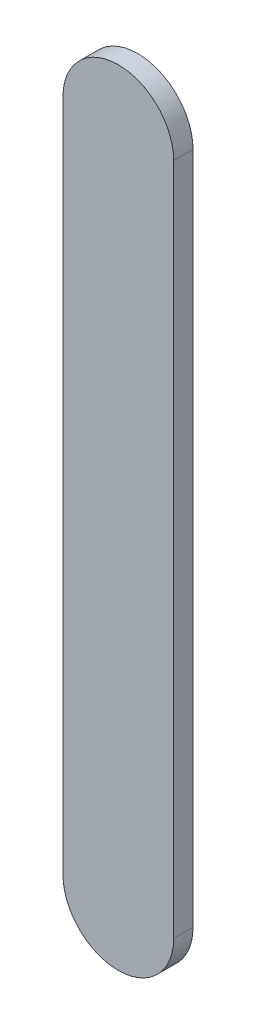
ISO-10303-21;
HEADER;
FILE_DESCRIPTION(('STEP AP214'),'2;1');
FILE_NAME('part.step','',(''),(''),'','','');
FILE_SCHEMA(('AUTOMOTIVE_DESIGN { 1 0 10303 214 1 1 1 1 }'));
ENDSEC;
DATA;
#1=APPLICATION_CONTEXT('core data for automotive mechanical design processes');
#2=APPLICATION_PROTOCOL_DEFINITION('international standard','automotive_design',2000,#1);
#3=PRODUCT_CONTEXT('',#1,'mechanical');
#4=PRODUCT('Part','Part','',(#3));
#5=PRODUCT_RELATED_PRODUCT_CATEGORY('part','',(#4));
#6=PRODUCT_DEFINITION_FORMATION('','',#4);
#7=PRODUCT_DEFINITION_CONTEXT('part definition',#1,'design');
#8=PRODUCT_DEFINITION('design','',#6,#7);
#9=PRODUCT_DEFINITION_SHAPE('','',#8);
#10=(LENGTH_UNIT() NAMED_UNIT(*) SI_UNIT(.MILLI.,.METRE.));
#11=(NAMED_UNIT(*) PLANE_ANGLE_UNIT() SI_UNIT($,.RADIAN.));
#12=(NAMED_UNIT(*) SI_UNIT($,.STERADIAN.) SOLID_ANGLE_UNIT());
#13=UNCERTAINTY_MEASURE_WITH_UNIT(LENGTH_MEASURE(1.E-05),#10,'distance_accuracy_value','');
#14=(GEOMETRIC_REPRESENTATION_CONTEXT(3) GLOBAL_UNCERTAINTY_ASSIGNED_CONTEXT((#13)) GLOBAL_UNIT_ASSIGNED_CONTEXT((#10,
#11,#12)) REPRESENTATION_CONTEXT('',''));
#15=CARTESIAN_POINT('',(0.,0.,0.));
#16=DIRECTION('',(0.,0.,1.));
#17=DIRECTION('',(1.,0.,0.));
#18=AXIS2_PLACEMENT_3D('',#15,#16,#17);
#19=CARTESIAN_POINT('',(83.55,-109.4625,1.635));
#20=DIRECTION('',(0.,0.,1.));
#21=DIRECTION('',(1.,0.,0.));
#22=AXIS2_PLACEMENT_3D('',#19,#20,#21);
#23=PLANE('',#22);
#24=DIRECTION('',(0.,1.,0.));
#25=VECTOR('',#24,1.);
#26=CARTESIAN_POINT('',(83.55,-109.4625,1.635));
#27=LINE('',#26,#25);
#28=CARTESIAN_POINT('',(83.55,-109.4625,1.635));
#29=VERTEX_POINT('',#28);
#30=CARTESIAN_POINT('',(83.55,-108.245,1.635));
#31=VERTEX_POINT('',#30);
#32=EDGE_CURVE('E69',#29,#31,#27,.T.);
#33=ORIENTED_EDGE('',*,*,#32,.T.);
#34=CARTESIAN_POINT('',(83.45,-108.245,1.635));
#35=DIRECTION('',(0.,0.,1.));
#36=DIRECTION('',(1.,-1.42108547152E-13,0.));
#37=AXIS2_PLACEMENT_3D('',#34,#35,#36);
#38=CIRCLE('',#37,0.1);
#39=CARTESIAN_POINT('',(83.35,-108.245,1.635));
#40=VERTEX_POINT('',#39);
#41=EDGE_CURVE('E100',#31,#40,#38,.T.);
#42=ORIENTED_EDGE('',*,*,#41,.T.);
#43=DIRECTION('',(0.,-1.,0.));
#44=VECTOR('',#43,1.);
#45=CARTESIAN_POINT('',(83.35,-108.245,1.635));
#46=LINE('',#45,#44);
#47=CARTESIAN_POINT('',(83.35,-109.4625,1.635));
#48=VERTEX_POINT('',#47);
#49=EDGE_CURVE('E71',#40,#48,#46,.T.);
#50=ORIENTED_EDGE('',*,*,#49,.T.);
#51=CARTESIAN_POINT('',(83.45,-109.4625,1.635));
#52=DIRECTION('',(0.,0.,1.));
#53=DIRECTION('',(-1.,0.,0.));
#54=AXIS2_PLACEMENT_3D('',#51,#52,#53);
#55=CIRCLE('',#54,0.1);
#56=EDGE_CURVE('E11',#48,#29,#55,.T.);
#57=ORIENTED_EDGE('',*,*,#56,.T.);
#58=EDGE_LOOP('',(#33,#42,#50,#57));
#59=FACE_BOUND('',#58,.T.);
#60=ADVANCED_FACE('F17',(#59),#23,.T.);
#61=CARTESIAN_POINT('',(83.55,-109.4625,1.6));
#62=DIRECTION('',(0.,0.,1.));
#63=DIRECTION('',(1.,0.,0.));
#64=AXIS2_PLACEMENT_3D('',#61,#62,#63);
#65=PLANE('',#64);
#66=CARTESIAN_POINT('',(83.45,-109.4625,1.6));
#67=DIRECTION('',(0.,0.,1.));
#68=DIRECTION('',(-1.,0.,0.));
#69=AXIS2_PLACEMENT_3D('',#66,#67,#68);
#70=CIRCLE('',#69,0.1);
#71=CARTESIAN_POINT('',(83.35,-109.4625,1.6));
#72=VERTEX_POINT('',#71);
#73=CARTESIAN_POINT('',(83.55,-109.4625,1.6));
#74=VERTEX_POINT('',#73);
#75=EDGE_CURVE('E25',#72,#74,#70,.T.);
#76=ORIENTED_EDGE('',*,*,#75,.F.);
#77=DIRECTION('',(0.,-1.,0.));
#78=VECTOR('',#77,1.);
#79=CARTESIAN_POINT('',(83.35,-108.245,1.6));
#80=LINE('',#79,#78);
#81=CARTESIAN_POINT('',(83.35,-108.245,1.6));
#82=VERTEX_POINT('',#81);
#83=EDGE_CURVE('E95',#82,#72,#80,.T.);
#84=ORIENTED_EDGE('',*,*,#83,.F.);
#85=CARTESIAN_POINT('',(83.45,-108.245,1.6));
#86=DIRECTION('',(0.,0.,1.));
#87=DIRECTION('',(1.,-1.42108547152E-13,0.));
#88=AXIS2_PLACEMENT_3D('',#85,#86,#87);
#89=CIRCLE('',#88,0.1);
#90=CARTESIAN_POINT('',(83.55,-108.245,1.6));
#91=VERTEX_POINT('',#90);
#92=EDGE_CURVE('E79',#91,#82,#89,.T.);
#93=ORIENTED_EDGE('',*,*,#92,.F.);
#94=DIRECTION('',(0.,1.,0.));
#95=VECTOR('',#94,1.);
#96=CARTESIAN_POINT('',(83.55,-109.4625,1.6));
#97=LINE('',#96,#95);
#98=EDGE_CURVE('E90',#74,#91,#97,.T.);
#99=ORIENTED_EDGE('',*,*,#98,.F.);
#100=EDGE_LOOP('',(#76,#84,#93,#99));
#101=FACE_BOUND('',#100,.T.);
#102=ADVANCED_FACE('F151',(#101),#65,.F.);
#103=CARTESIAN_POINT('',(83.45,-109.4625,1.6));
#104=DIRECTION('',(0.,0.,-1.));
#105=DIRECTION('',(-1.,0.,0.));
#106=AXIS2_PLACEMENT_3D('',#103,#104,#105);
#107=CYLINDRICAL_SURFACE('',#106,0.1);
#108=ORIENTED_EDGE('',*,*,#75,.T.);
#109=DIRECTION('',(0.,0.,1.));
#110=VECTOR('',#109,1.);
#111=CARTESIAN_POINT('',(83.55,-109.4625,1.6));
#112=LINE('',#111,#110);
#113=EDGE_CURVE('E74',#74,#29,#112,.T.);
#114=ORIENTED_EDGE('',*,*,#113,.T.);
#115=ORIENTED_EDGE('',*,*,#56,.F.);
#116=DIRECTION('',(0.,0.,1.));
#117=VECTOR('',#116,1.);
#118=CARTESIAN_POINT('',(83.35,-109.4625,1.6));
#119=LINE('',#118,#117);
#120=EDGE_CURVE('E99',#72,#48,#119,.T.);
#121=ORIENTED_EDGE('',*,*,#120,.F.);
#122=EDGE_LOOP('',(#108,#114,#115,#121));
#123=FACE_BOUND('',#122,.T.);
#124=ADVANCED_FACE('F75',(#123),#107,.T.);
#125=CARTESIAN_POINT('',(83.35,-108.245,1.6));
#126=DIRECTION('',(1.,0.,0.));
#127=DIRECTION('',(0.,1.,0.));
#128=AXIS2_PLACEMENT_3D('',#125,#126,#127);
#129=PLANE('',#128);
#130=ORIENTED_EDGE('',*,*,#83,.T.);
#131=ORIENTED_EDGE('',*,*,#120,.T.);
#132=ORIENTED_EDGE('',*,*,#49,.F.);
#133=DIRECTION('',(0.,0.,1.));
#134=VECTOR('',#133,1.);
#135=CARTESIAN_POINT('',(83.35,-108.245,1.6));
#136=LINE('',#135,#134);
#137=EDGE_CURVE('E93',#82,#40,#136,.T.);
#138=ORIENTED_EDGE('',*,*,#137,.F.);
#139=EDGE_LOOP('',(#130,#131,#132,#138));
#140=FACE_BOUND('',#139,.T.);
#141=ADVANCED_FACE('F156',(#140),#129,.F.);
#142=CARTESIAN_POINT('',(83.45,-108.245,1.6));
#143=DIRECTION('',(0.,0.,-1.));
#144=DIRECTION('',(1.,-1.42108547152E-13,0.));
#145=AXIS2_PLACEMENT_3D('',#142,#143,#144);
#146=CYLINDRICAL_SURFACE('',#145,0.1);
#147=ORIENTED_EDGE('',*,*,#92,.T.);
#148=ORIENTED_EDGE('',*,*,#137,.T.);
#149=ORIENTED_EDGE('',*,*,#41,.F.);
#150=DIRECTION('',(0.,0.,1.));
#151=VECTOR('',#150,1.);
#152=CARTESIAN_POINT('',(83.55,-108.245,1.6));
#153=LINE('',#152,#151);
#154=EDGE_CURVE('E83',#91,#31,#153,.T.);
#155=ORIENTED_EDGE('',*,*,#154,.F.);
#156=EDGE_LOOP('',(#147,#148,#149,#155));
#157=FACE_BOUND('',#156,.T.);
#158=ADVANCED_FACE('F154',(#157),#146,.T.);
#159=CARTESIAN_POINT('',(83.55,-109.4625,1.6));
#160=DIRECTION('',(-1.,0.,0.));
#161=DIRECTION('',(0.,0.,1.));
#162=AXIS2_PLACEMENT_3D('',#159,#160,#161);
#163=PLANE('',#162);
#164=ORIENTED_EDGE('',*,*,#98,.T.);
#165=ORIENTED_EDGE('',*,*,#154,.T.);
#166=ORIENTED_EDGE('',*,*,#32,.F.);
#167=ORIENTED_EDGE('',*,*,#113,.F.);
#168=EDGE_LOOP('',(#164,#165,#166,#167));
#169=FACE_BOUND('',#168,.T.);
#170=ADVANCED_FACE('F81',(#169),#163,.F.);
#171=CLOSED_SHELL('',(#60,#102,#124,#141,#158,#170));
#172=MANIFOLD_SOLID_BREP('B1',#171);
#173=ADVANCED_BREP_SHAPE_REPRESENTATION('',(#18,#172),#14);
#174=SHAPE_DEFINITION_REPRESENTATION(#9,#173);
ENDSEC;
END-ISO-10303-21;
